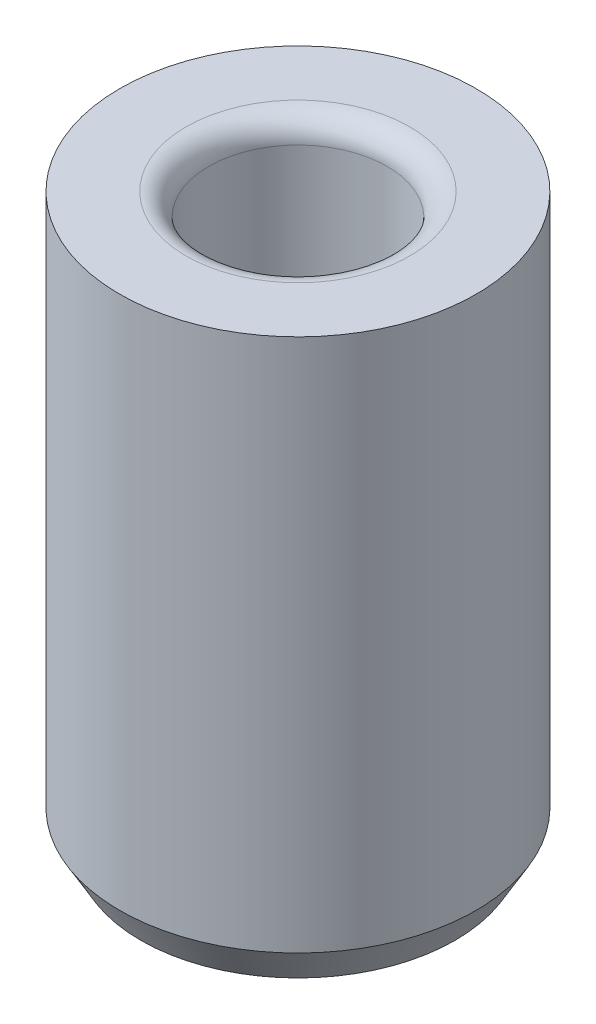
ISO-10303-21;
HEADER;
FILE_DESCRIPTION(('STEP AP214'),'2;1');
FILE_NAME('part.step','',(''),(''),'','','');
FILE_SCHEMA(('AUTOMOTIVE_DESIGN { 1 0 10303 214 1 1 1 1 }'));
ENDSEC;
DATA;
#1=APPLICATION_CONTEXT('core data for automotive mechanical design processes');
#2=APPLICATION_PROTOCOL_DEFINITION('international standard','automotive_design',2000,#1);
#3=PRODUCT_CONTEXT('',#1,'mechanical');
#4=PRODUCT('Part','Part','',(#3));
#5=PRODUCT_RELATED_PRODUCT_CATEGORY('part','',(#4));
#6=PRODUCT_DEFINITION_FORMATION('','',#4);
#7=PRODUCT_DEFINITION_CONTEXT('part definition',#1,'design');
#8=PRODUCT_DEFINITION('design','',#6,#7);
#9=PRODUCT_DEFINITION_SHAPE('','',#8);
#10=(LENGTH_UNIT() NAMED_UNIT(*) SI_UNIT(.MILLI.,.METRE.));
#11=(NAMED_UNIT(*) PLANE_ANGLE_UNIT() SI_UNIT($,.RADIAN.));
#12=(NAMED_UNIT(*) SI_UNIT($,.STERADIAN.) SOLID_ANGLE_UNIT());
#13=UNCERTAINTY_MEASURE_WITH_UNIT(LENGTH_MEASURE(1.E-05),#10,'distance_accuracy_value','');
#14=(GEOMETRIC_REPRESENTATION_CONTEXT(3) GLOBAL_UNCERTAINTY_ASSIGNED_CONTEXT((#13)) GLOBAL_UNIT_ASSIGNED_CONTEXT((#10,
#11,#12)) REPRESENTATION_CONTEXT('',''));
#15=CARTESIAN_POINT('',(0.,0.,0.));
#16=DIRECTION('',(0.,0.,1.));
#17=DIRECTION('',(1.,0.,0.));
#18=AXIS2_PLACEMENT_3D('',#15,#16,#17);
#19=CARTESIAN_POINT('',(0.,0.,0.));
#20=DIRECTION('',(0.,1.,0.));
#21=DIRECTION('',(-1.,0.,0.));
#22=AXIS2_PLACEMENT_3D('',#19,#20,#21);
#23=CYLINDRICAL_SURFACE('',#22,3.96875);
#24=CARTESIAN_POINT('',(0.,-11.8872,0.));
#25=DIRECTION('',(0.,1.,0.));
#26=DIRECTION('',(-1.,0.,0.));
#27=AXIS2_PLACEMENT_3D('',#24,#25,#26);
#28=CIRCLE('',#27,3.96875);
#29=CARTESIAN_POINT('',(-3.96875,-11.8872,0.));
#30=VERTEX_POINT('',#29);
#31=EDGE_CURVE('E41',#30,#30,#28,.T.);
#32=ORIENTED_EDGE('',*,*,#31,.T.);
#33=EDGE_LOOP('',(#32));
#34=FACE_BOUND('',#33,.T.);
#35=CARTESIAN_POINT('',(0.,0.,0.));
#36=DIRECTION('',(0.,1.,0.));
#37=DIRECTION('',(-1.,0.,0.));
#38=AXIS2_PLACEMENT_3D('',#35,#36,#37);
#39=CIRCLE('',#38,3.96875);
#40=CARTESIAN_POINT('',(-3.96875,0.,0.));
#41=VERTEX_POINT('',#40);
#42=EDGE_CURVE('E45',#41,#41,#39,.T.);
#43=ORIENTED_EDGE('',*,*,#42,.F.);
#44=EDGE_LOOP('',(#43));
#45=FACE_BOUND('',#44,.T.);
#46=ADVANCED_FACE('F35',(#34,#45),#23,.T.);
#47=CARTESIAN_POINT('',(2.492375,0.,0.));
#48=DIRECTION('',(0.,-1.,0.));
#49=DIRECTION('',(1.,0.,0.));
#50=AXIS2_PLACEMENT_3D('',#47,#48,#49);
#51=PLANE('',#50);
#52=CARTESIAN_POINT('',(0.,0.,0.));
#53=DIRECTION('',(0.,1.,0.));
#54=DIRECTION('',(-1.,0.,0.));
#55=AXIS2_PLACEMENT_3D('',#52,#53,#54);
#56=CIRCLE('',#55,2.492375);
#57=CARTESIAN_POINT('',(-2.492375,0.,0.));
#58=VERTEX_POINT('',#57);
#59=EDGE_CURVE('E49',#58,#58,#56,.T.);
#60=ORIENTED_EDGE('',*,*,#59,.F.);
#61=EDGE_LOOP('',(#60));
#62=FACE_BOUND('',#61,.T.);
#63=ORIENTED_EDGE('',*,*,#42,.T.);
#64=EDGE_LOOP('',(#63));
#65=FACE_BOUND('',#64,.T.);
#66=ADVANCED_FACE('F90',(#62,#65),#51,.F.);
#67=CARTESIAN_POINT('',(0.,-0.508,0.));
#68=DIRECTION('',(0.,1.,0.));
#69=DIRECTION('',(-1.,0.,0.));
#70=AXIS2_PLACEMENT_3D('',#67,#68,#69);
#71=TOROIDAL_SURFACE('',#70,2.492375,0.508);
#72=CARTESIAN_POINT('',(0.,-0.508,0.));
#73=DIRECTION('',(0.,1.,0.));
#74=DIRECTION('',(-1.,0.,0.));
#75=AXIS2_PLACEMENT_3D('',#72,#73,#74);
#76=CIRCLE('',#75,1.984375);
#77=CARTESIAN_POINT('',(-1.984375,-0.508000000000001,0.));
#78=VERTEX_POINT('',#77);
#79=EDGE_CURVE('E61',#78,#78,#76,.T.);
#80=ORIENTED_EDGE('',*,*,#79,.F.);
#81=EDGE_LOOP('',(#80));
#82=FACE_BOUND('',#81,.T.);
#83=ORIENTED_EDGE('',*,*,#59,.T.);
#84=EDGE_LOOP('',(#83));
#85=FACE_BOUND('',#84,.T.);
#86=ADVANCED_FACE('F84',(#82,#85),#71,.T.);
#87=CARTESIAN_POINT('',(0.,0.,0.));
#88=DIRECTION('',(0.,1.,0.));
#89=DIRECTION('',(-1.,0.,0.));
#90=AXIS2_PLACEMENT_3D('',#87,#88,#89);
#91=CYLINDRICAL_SURFACE('',#90,1.984375);
#92=CARTESIAN_POINT('',(0.,-12.319,0.));
#93=DIRECTION('',(0.,1.,0.));
#94=DIRECTION('',(-1.,0.,0.));
#95=AXIS2_PLACEMENT_3D('',#92,#93,#94);
#96=CIRCLE('',#95,1.984375);
#97=CARTESIAN_POINT('',(-1.984375,-12.319,0.));
#98=VERTEX_POINT('',#97);
#99=EDGE_CURVE('E64',#98,#98,#96,.T.);
#100=ORIENTED_EDGE('',*,*,#99,.F.);
#101=EDGE_LOOP('',(#100));
#102=FACE_BOUND('',#101,.T.);
#103=ORIENTED_EDGE('',*,*,#79,.T.);
#104=EDGE_LOOP('',(#103));
#105=FACE_BOUND('',#104,.T.);
#106=ADVANCED_FACE('F78',(#102,#105),#91,.F.);
#107=CARTESIAN_POINT('',(0.,-12.319,0.));
#108=DIRECTION('',(0.,-1.,0.));
#109=DIRECTION('',(1.,0.,0.));
#110=AXIS2_PLACEMENT_3D('',#107,#108,#109);
#111=CONICAL_SURFACE('',#110,1.984375,0.785398163397449);
#112=CARTESIAN_POINT('',(0.,-12.7,0.));
#113=DIRECTION('',(0.,1.,0.));
#114=DIRECTION('',(-1.,0.,0.));
#115=AXIS2_PLACEMENT_3D('',#112,#113,#114);
#116=CIRCLE('',#115,2.365375);
#117=CARTESIAN_POINT('',(-2.365375,-12.7,0.));
#118=VERTEX_POINT('',#117);
#119=EDGE_CURVE('E68',#118,#118,#116,.T.);
#120=ORIENTED_EDGE('',*,*,#119,.F.);
#121=EDGE_LOOP('',(#120));
#122=FACE_BOUND('',#121,.T.);
#123=ORIENTED_EDGE('',*,*,#99,.T.);
#124=EDGE_LOOP('',(#123));
#125=FACE_BOUND('',#124,.T.);
#126=ADVANCED_FACE('F75',(#122,#125),#111,.F.);
#127=CARTESIAN_POINT('',(2.365375,-12.7,0.));
#128=DIRECTION('',(0.,1.,0.));
#129=DIRECTION('',(-1.,0.,0.));
#130=AXIS2_PLACEMENT_3D('',#127,#128,#129);
#131=PLANE('',#130);
#132=CARTESIAN_POINT('',(0.,-12.7,0.));
#133=DIRECTION('',(0.,1.,0.));
#134=DIRECTION('',(-1.,0.,0.));
#135=AXIS2_PLACEMENT_3D('',#132,#133,#134);
#136=CIRCLE('',#135,3.49947970120267);
#137=CARTESIAN_POINT('',(-3.49947970120267,-12.7,0.));
#138=VERTEX_POINT('',#137);
#139=EDGE_CURVE('E11',#138,#138,#136,.F.);
#140=ORIENTED_EDGE('',*,*,#139,.T.);
#141=EDGE_LOOP('',(#140));
#142=FACE_BOUND('',#141,.T.);
#143=ORIENTED_EDGE('',*,*,#119,.T.);
#144=EDGE_LOOP('',(#143));
#145=FACE_BOUND('',#144,.T.);
#146=ADVANCED_FACE('F73',(#142,#145),#131,.F.);
#147=CARTESIAN_POINT('',(0.,-11.8872,0.));
#148=DIRECTION('',(0.,1.,0.));
#149=DIRECTION('',(-1.,0.,0.));
#150=AXIS2_PLACEMENT_3D('',#147,#148,#149);
#151=CONICAL_SURFACE('',#150,3.96875,0.523598775598299);
#152=ORIENTED_EDGE('',*,*,#139,.F.);
#153=EDGE_LOOP('',(#152));
#154=FACE_BOUND('',#153,.T.);
#155=ORIENTED_EDGE('',*,*,#31,.F.);
#156=EDGE_LOOP('',(#155));
#157=FACE_BOUND('',#156,.T.);
#158=ADVANCED_FACE('F37',(#154,#157),#151,.T.);
#159=CLOSED_SHELL('',(#46,#66,#86,#106,#126,#146,#158));
#160=MANIFOLD_SOLID_BREP('B2',#159);
#161=ADVANCED_BREP_SHAPE_REPRESENTATION('',(#18,#160),#14);
#162=SHAPE_DEFINITION_REPRESENTATION(#9,#161);
ENDSEC;
END-ISO-10303-21;
